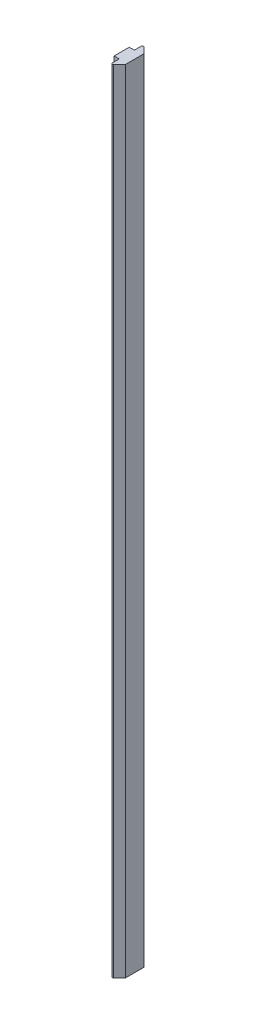
ISO-10303-21;
HEADER;
FILE_DESCRIPTION(('STEP AP214'),'2;1');
FILE_NAME('part.step','',(''),(''),'','','');
FILE_SCHEMA(('AUTOMOTIVE_DESIGN { 1 0 10303 214 1 1 1 1 }'));
ENDSEC;
DATA;
#1=APPLICATION_CONTEXT('core data for automotive mechanical design processes');
#2=APPLICATION_PROTOCOL_DEFINITION('international standard','automotive_design',2000,#1);
#3=PRODUCT_CONTEXT('',#1,'mechanical');
#4=PRODUCT('Part','Part','',(#3));
#5=PRODUCT_RELATED_PRODUCT_CATEGORY('part','',(#4));
#6=PRODUCT_DEFINITION_FORMATION('','',#4);
#7=PRODUCT_DEFINITION_CONTEXT('part definition',#1,'design');
#8=PRODUCT_DEFINITION('design','',#6,#7);
#9=PRODUCT_DEFINITION_SHAPE('','',#8);
#10=(LENGTH_UNIT() NAMED_UNIT(*) SI_UNIT(.MILLI.,.METRE.));
#11=(NAMED_UNIT(*) PLANE_ANGLE_UNIT() SI_UNIT($,.RADIAN.));
#12=(NAMED_UNIT(*) SI_UNIT($,.STERADIAN.) SOLID_ANGLE_UNIT());
#13=UNCERTAINTY_MEASURE_WITH_UNIT(LENGTH_MEASURE(1.E-05),#10,'distance_accuracy_value','');
#14=(GEOMETRIC_REPRESENTATION_CONTEXT(3) GLOBAL_UNCERTAINTY_ASSIGNED_CONTEXT((#13)) GLOBAL_UNIT_ASSIGNED_CONTEXT((#10,
#11,#12)) REPRESENTATION_CONTEXT('',''));
#15=CARTESIAN_POINT('',(0.,0.,0.));
#16=DIRECTION('',(0.,0.,1.));
#17=DIRECTION('',(1.,0.,0.));
#18=AXIS2_PLACEMENT_3D('',#15,#16,#17);
#19=CARTESIAN_POINT('',(-3.23933986621706,300.,2.87805090450655));
#20=DIRECTION('',(0.,0.,-1.));
#21=DIRECTION('',(-1.,0.,0.));
#22=AXIS2_PLACEMENT_3D('',#19,#20,#21);
#23=PLANE('',#22);
#24=DIRECTION('',(1.,0.,0.));
#25=VECTOR('',#24,1.);
#26=CARTESIAN_POINT('',(-3.23933986621706,0.,2.87805090450655));
#27=LINE('',#26,#25);
#28=CARTESIAN_POINT('',(-5.18933983831155,0.,2.87805090450655));
#29=VERTEX_POINT('',#28);
#30=CARTESIAN_POINT('',(-3.23933986621706,0.,2.87805090450655));
#31=VERTEX_POINT('',#30);
#32=EDGE_CURVE('E150',#29,#31,#27,.T.);
#33=ORIENTED_EDGE('',*,*,#32,.T.);
#34=DIRECTION('',(0.,-1.,0.));
#35=VECTOR('',#34,1.);
#36=CARTESIAN_POINT('',(-3.23933986621706,300.,2.87805090450655));
#37=LINE('',#36,#35);
#38=CARTESIAN_POINT('',(-3.23933986621706,300.,2.87805090450655));
#39=VERTEX_POINT('',#38);
#40=EDGE_CURVE('E11',#39,#31,#37,.T.);
#41=ORIENTED_EDGE('',*,*,#40,.F.);
#42=DIRECTION('',(1.,0.,0.));
#43=VECTOR('',#42,1.);
#44=CARTESIAN_POINT('',(-3.23933986621706,300.,2.87805090450655));
#45=LINE('',#44,#43);
#46=CARTESIAN_POINT('',(-5.18933983831155,300.,2.87805090450655));
#47=VERTEX_POINT('',#46);
#48=EDGE_CURVE('E165',#47,#39,#45,.T.);
#49=ORIENTED_EDGE('',*,*,#48,.F.);
#50=DIRECTION('',(0.,-1.,0.));
#51=VECTOR('',#50,1.);
#52=CARTESIAN_POINT('',(-5.18933983831155,300.,2.87805090450655));
#53=LINE('',#52,#51);
#54=EDGE_CURVE('E142',#47,#29,#53,.T.);
#55=ORIENTED_EDGE('',*,*,#54,.T.);
#56=EDGE_LOOP('',(#33,#41,#49,#55));
#57=FACE_BOUND('',#56,.T.);
#58=ADVANCED_FACE('F39',(#57),#23,.F.);
#59=CARTESIAN_POINT('',(-3.23933986621706,300.,2.87805090450655));
#60=DIRECTION('',(1.,0.,0.));
#61=DIRECTION('',(0.,0.,-1.));
#62=AXIS2_PLACEMENT_3D('',#59,#60,#61);
#63=PLANE('',#62);
#64=DIRECTION('',(0.,0.,1.));
#65=VECTOR('',#64,1.);
#66=CARTESIAN_POINT('',(-3.23933986621706,0.,2.87805090450655));
#67=LINE('',#66,#65);
#68=CARTESIAN_POINT('',(-3.23933986621706,0.,5.42744122113594));
#69=VERTEX_POINT('',#68);
#70=EDGE_CURVE('E148',#31,#69,#67,.T.);
#71=ORIENTED_EDGE('',*,*,#70,.T.);
#72=DIRECTION('',(0.,-1.,0.));
#73=VECTOR('',#72,1.);
#74=CARTESIAN_POINT('',(-3.23933986621706,300.,5.42744122113594));
#75=LINE('',#74,#73);
#76=CARTESIAN_POINT('',(-3.23933986621706,300.,5.42744122113594));
#77=VERTEX_POINT('',#76);
#78=EDGE_CURVE('E50',#77,#69,#75,.T.);
#79=ORIENTED_EDGE('',*,*,#78,.F.);
#80=DIRECTION('',(0.,0.,1.));
#81=VECTOR('',#80,1.);
#82=CARTESIAN_POINT('',(-3.23933986621706,300.,2.87805090450655));
#83=LINE('',#82,#81);
#84=EDGE_CURVE('E104',#39,#77,#83,.T.);
#85=ORIENTED_EDGE('',*,*,#84,.F.);
#86=ORIENTED_EDGE('',*,*,#40,.T.);
#87=EDGE_LOOP('',(#71,#79,#85,#86));
#88=FACE_BOUND('',#87,.T.);
#89=ADVANCED_FACE('F215',(#88),#63,.F.);
#90=CARTESIAN_POINT('',(-2.78933986621717,300.,5.42744122113487));
#91=DIRECTION('',(0.,-1.,0.));
#92=DIRECTION('',(0.,0.,-1.));
#93=AXIS2_PLACEMENT_3D('',#90,#91,#92);
#94=CYLINDRICAL_SURFACE('',#93,0.449999999999945);
#95=CARTESIAN_POINT('',(-2.78933986621717,0.,5.42744122113487));
#96=DIRECTION('',(0.,1.,0.));
#97=DIRECTION('',(0.,0.,1.));
#98=AXIS2_PLACEMENT_3D('',#95,#96,#97);
#99=CIRCLE('',#98,0.449999999999945);
#100=CARTESIAN_POINT('',(-2.47114181468326,0.,5.74563927266877));
#101=VERTEX_POINT('',#100);
#102=EDGE_CURVE('E152',#69,#101,#99,.T.);
#103=ORIENTED_EDGE('',*,*,#102,.T.);
#104=DIRECTION('',(0.,-1.,0.));
#105=VECTOR('',#104,1.);
#106=CARTESIAN_POINT('',(-2.47114181468326,300.,5.74563927266877));
#107=LINE('',#106,#105);
#108=CARTESIAN_POINT('',(-2.47114181468326,300.,5.74563927266877));
#109=VERTEX_POINT('',#108);
#110=EDGE_CURVE('E178',#109,#101,#107,.T.);
#111=ORIENTED_EDGE('',*,*,#110,.F.);
#112=CARTESIAN_POINT('',(-2.78933986621717,300.,5.42744122113487));
#113=DIRECTION('',(0.,1.,0.));
#114=DIRECTION('',(0.,0.,1.));
#115=AXIS2_PLACEMENT_3D('',#112,#113,#114);
#116=CIRCLE('',#115,0.449999999999945);
#117=EDGE_CURVE('E186',#77,#109,#116,.T.);
#118=ORIENTED_EDGE('',*,*,#117,.F.);
#119=ORIENTED_EDGE('',*,*,#78,.T.);
#120=EDGE_LOOP('',(#103,#111,#118,#119));
#121=FACE_BOUND('',#120,.T.);
#122=ADVANCED_FACE('F182',(#121),#94,.T.);
#123=CARTESIAN_POINT('',(-2.47114181468322,300.,5.74563927266882));
#124=DIRECTION('',(-0.707106781186551,0.,-0.707106781186544));
#125=DIRECTION('',(-0.707106781186544,0.,0.707106781186551));
#126=AXIS2_PLACEMENT_3D('',#123,#124,#125);
#127=PLANE('',#126);
#128=DIRECTION('',(0.707106781186544,0.,-0.707106781186551));
#129=VECTOR('',#128,1.);
#130=CARTESIAN_POINT('',(-2.47114181468322,0.,5.74563927266882));
#131=LINE('',#130,#129);
#132=CARTESIAN_POINT('',(-0.249999999999999,0.,3.52449745798557));
#133=VERTEX_POINT('',#132);
#134=EDGE_CURVE('E153',#101,#133,#131,.T.);
#135=ORIENTED_EDGE('',*,*,#134,.T.);
#136=DIRECTION('',(0.,-1.,0.));
#137=VECTOR('',#136,1.);
#138=CARTESIAN_POINT('',(-0.249999999999999,300.,3.52449745798557));
#139=LINE('',#138,#137);
#140=CARTESIAN_POINT('',(-0.249999999999999,300.,3.52449745798557));
#141=VERTEX_POINT('',#140);
#142=EDGE_CURVE('E172',#141,#133,#139,.T.);
#143=ORIENTED_EDGE('',*,*,#142,.F.);
#144=DIRECTION('',(0.707106781186544,0.,-0.707106781186551));
#145=VECTOR('',#144,1.);
#146=CARTESIAN_POINT('',(-2.47114181468322,300.,5.74563927266882));
#147=LINE('',#146,#145);
#148=EDGE_CURVE('E204',#109,#141,#147,.T.);
#149=ORIENTED_EDGE('',*,*,#148,.F.);
#150=ORIENTED_EDGE('',*,*,#110,.T.);
#151=EDGE_LOOP('',(#135,#143,#149,#150));
#152=FACE_BOUND('',#151,.T.);
#153=ADVANCED_FACE('F193',(#152),#127,.F.);
#154=CARTESIAN_POINT('',(-0.25,300.,-3.52449745798557));
#155=DIRECTION('',(-1.,0.,0.));
#156=DIRECTION('',(0.,0.,1.));
#157=AXIS2_PLACEMENT_3D('',#154,#155,#156);
#158=PLANE('',#157);
#159=DIRECTION('',(0.,0.,-1.));
#160=VECTOR('',#159,1.);
#161=CARTESIAN_POINT('',(-0.25,0.,-3.52449745798557));
#162=LINE('',#161,#160);
#163=CARTESIAN_POINT('',(-0.25,0.,-3.52449745798557));
#164=VERTEX_POINT('',#163);
#165=EDGE_CURVE('E157',#133,#164,#162,.T.);
#166=ORIENTED_EDGE('',*,*,#165,.T.);
#167=DIRECTION('',(0.,-1.,0.));
#168=VECTOR('',#167,1.);
#169=CARTESIAN_POINT('',(-0.25,300.,-3.52449745798557));
#170=LINE('',#169,#168);
#171=CARTESIAN_POINT('',(-0.25,300.,-3.52449745798557));
#172=VERTEX_POINT('',#171);
#173=EDGE_CURVE('E175',#172,#164,#170,.T.);
#174=ORIENTED_EDGE('',*,*,#173,.F.);
#175=DIRECTION('',(0.,0.,-1.));
#176=VECTOR('',#175,1.);
#177=CARTESIAN_POINT('',(-0.25,300.,-3.52449745798557));
#178=LINE('',#177,#176);
#179=EDGE_CURVE('E202',#141,#172,#178,.T.);
#180=ORIENTED_EDGE('',*,*,#179,.F.);
#181=ORIENTED_EDGE('',*,*,#142,.T.);
#182=EDGE_LOOP('',(#166,#174,#180,#181));
#183=FACE_BOUND('',#182,.T.);
#184=ADVANCED_FACE('F198',(#183),#158,.F.);
#185=CARTESIAN_POINT('',(-0.25,300.,-3.52449745798557));
#186=DIRECTION('',(-0.707106781186547,0.,0.707106781186548));
#187=DIRECTION('',(0.707106781186548,0.,0.707106781186547));
#188=AXIS2_PLACEMENT_3D('',#185,#186,#187);
#189=PLANE('',#188);
#190=DIRECTION('',(-0.707106781186548,0.,-0.707106781186547));
#191=VECTOR('',#190,1.);
#192=CARTESIAN_POINT('',(-0.25,0.,-3.52449745798557));
#193=LINE('',#192,#191);
#194=CARTESIAN_POINT('',(-2.47114181360244,0.,-5.74563927158801));
#195=VERTEX_POINT('',#194);
#196=EDGE_CURVE('E156',#164,#195,#193,.T.);
#197=ORIENTED_EDGE('',*,*,#196,.T.);
#198=DIRECTION('',(0.,-1.,0.));
#199=VECTOR('',#198,1.);
#200=CARTESIAN_POINT('',(-2.47114181360244,300.,-5.74563927158801));
#201=LINE('',#200,#199);
#202=CARTESIAN_POINT('',(-2.47114181360244,300.,-5.74563927158801));
#203=VERTEX_POINT('',#202);
#204=EDGE_CURVE('E170',#203,#195,#201,.T.);
#205=ORIENTED_EDGE('',*,*,#204,.F.);
#206=DIRECTION('',(-0.707106781186548,0.,-0.707106781186547));
#207=VECTOR('',#206,1.);
#208=CARTESIAN_POINT('',(-0.25,300.,-3.52449745798557));
#209=LINE('',#208,#207);
#210=EDGE_CURVE('E201',#172,#203,#209,.T.);
#211=ORIENTED_EDGE('',*,*,#210,.F.);
#212=ORIENTED_EDGE('',*,*,#173,.T.);
#213=EDGE_LOOP('',(#197,#205,#211,#212));
#214=FACE_BOUND('',#213,.T.);
#215=ADVANCED_FACE('F226',(#214),#189,.F.);
#216=CARTESIAN_POINT('',(-2.78933986469227,300.,-5.42744122049819));
#217=DIRECTION('',(0.,-1.,0.));
#218=DIRECTION('',(0.,0.,-1.));
#219=AXIS2_PLACEMENT_3D('',#216,#217,#218);
#220=CYLINDRICAL_SURFACE('',#219,0.449999999371916);
#221=CARTESIAN_POINT('',(-2.78933986469227,0.,-5.42744122049819));
#222=DIRECTION('',(0.,1.,0.));
#223=DIRECTION('',(0.,0.,1.));
#224=AXIS2_PLACEMENT_3D('',#221,#222,#223);
#225=CIRCLE('',#224,0.449999999371916);
#226=CARTESIAN_POINT('',(-3.23933986406418,0.,-5.42744122190511));
#227=VERTEX_POINT('',#226);
#228=EDGE_CURVE('E158',#195,#227,#225,.T.);
#229=ORIENTED_EDGE('',*,*,#228,.T.);
#230=DIRECTION('',(0.,-1.,0.));
#231=VECTOR('',#230,1.);
#232=CARTESIAN_POINT('',(-3.23933986406418,300.,-5.42744122190511));
#233=LINE('',#232,#231);
#234=CARTESIAN_POINT('',(-3.23933986406418,300.,-5.42744122190511));
#235=VERTEX_POINT('',#234);
#236=EDGE_CURVE('E138',#235,#227,#233,.T.);
#237=ORIENTED_EDGE('',*,*,#236,.F.);
#238=CARTESIAN_POINT('',(-2.78933986469227,300.,-5.42744122049819));
#239=DIRECTION('',(0.,1.,0.));
#240=DIRECTION('',(0.,0.,1.));
#241=AXIS2_PLACEMENT_3D('',#238,#239,#240);
#242=CIRCLE('',#241,0.449999999371916);
#243=EDGE_CURVE('E126',#203,#235,#242,.T.);
#244=ORIENTED_EDGE('',*,*,#243,.F.);
#245=ORIENTED_EDGE('',*,*,#204,.T.);
#246=EDGE_LOOP('',(#229,#237,#244,#245));
#247=FACE_BOUND('',#246,.T.);
#248=ADVANCED_FACE('F227',(#247),#220,.T.);
#249=CARTESIAN_POINT('',(-3.23933986406418,300.,-5.42744122190511));
#250=DIRECTION('',(1.,0.,0.));
#251=DIRECTION('',(0.,0.,-1.));
#252=AXIS2_PLACEMENT_3D('',#249,#250,#251);
#253=PLANE('',#252);
#254=DIRECTION('',(0.,0.,1.));
#255=VECTOR('',#254,1.);
#256=CARTESIAN_POINT('',(-3.23933986406418,0.,-5.42744122190511));
#257=LINE('',#256,#255);
#258=CARTESIAN_POINT('',(-3.23933986406424,0.,-2.87805084858101));
#259=VERTEX_POINT('',#258);
#260=EDGE_CURVE('E140',#227,#259,#257,.T.);
#261=ORIENTED_EDGE('',*,*,#260,.T.);
#262=DIRECTION('',(0.,-1.,0.));
#263=VECTOR('',#262,1.);
#264=CARTESIAN_POINT('',(-3.23933986406424,300.,-2.87805084858101));
#265=LINE('',#264,#263);
#266=CARTESIAN_POINT('',(-3.23933986406424,300.,-2.87805084858101));
#267=VERTEX_POINT('',#266);
#268=EDGE_CURVE('E132',#267,#259,#265,.T.);
#269=ORIENTED_EDGE('',*,*,#268,.F.);
#270=DIRECTION('',(0.,0.,1.));
#271=VECTOR('',#270,1.);
#272=CARTESIAN_POINT('',(-3.23933986406418,300.,-5.42744122190511));
#273=LINE('',#272,#271);
#274=EDGE_CURVE('E122',#235,#267,#273,.T.);
#275=ORIENTED_EDGE('',*,*,#274,.F.);
#276=ORIENTED_EDGE('',*,*,#236,.T.);
#277=EDGE_LOOP('',(#261,#269,#275,#276));
#278=FACE_BOUND('',#277,.T.);
#279=ADVANCED_FACE('F134',(#278),#253,.F.);
#280=CARTESIAN_POINT('',(-4.93933983831159,300.,-2.87805084858101));
#281=DIRECTION('',(0.,0.,1.));
#282=DIRECTION('',(1.,0.,0.));
#283=AXIS2_PLACEMENT_3D('',#280,#281,#282);
#284=PLANE('',#283);
#285=DIRECTION('',(-1.,0.,0.));
#286=VECTOR('',#285,1.);
#287=CARTESIAN_POINT('',(-4.93933983831159,0.,-2.87805084858101));
#288=LINE('',#287,#286);
#289=CARTESIAN_POINT('',(-5.18933983831155,0.,-2.87805084858101));
#290=VERTEX_POINT('',#289);
#291=EDGE_CURVE('E87',#259,#290,#288,.T.);
#292=ORIENTED_EDGE('',*,*,#291,.T.);
#293=DIRECTION('',(0.,-1.,0.));
#294=VECTOR('',#293,1.);
#295=CARTESIAN_POINT('',(-5.18933983831155,300.,-2.87805084858101));
#296=LINE('',#295,#294);
#297=CARTESIAN_POINT('',(-5.18933983831155,300.,-2.87805084858101));
#298=VERTEX_POINT('',#297);
#299=EDGE_CURVE('E137',#298,#290,#296,.T.);
#300=ORIENTED_EDGE('',*,*,#299,.F.);
#301=DIRECTION('',(-1.,0.,0.));
#302=VECTOR('',#301,1.);
#303=CARTESIAN_POINT('',(-3.23933986406424,300.,-2.87805084858101));
#304=LINE('',#303,#302);
#305=EDGE_CURVE('E128',#267,#298,#304,.T.);
#306=ORIENTED_EDGE('',*,*,#305,.F.);
#307=ORIENTED_EDGE('',*,*,#268,.T.);
#308=EDGE_LOOP('',(#292,#300,#306,#307));
#309=FACE_BOUND('',#308,.T.);
#310=ADVANCED_FACE('F141',(#309),#284,.F.);
#311=CARTESIAN_POINT('',(-5.18933983831155,300.,-2.87805084858101));
#312=DIRECTION('',(1.,0.,0.));
#313=DIRECTION('',(0.,0.,-1.));
#314=AXIS2_PLACEMENT_3D('',#311,#312,#313);
#315=PLANE('',#314);
#316=DIRECTION('',(0.,0.,1.));
#317=VECTOR('',#316,1.);
#318=CARTESIAN_POINT('',(-5.18933983831155,0.,-2.87805084858101));
#319=LINE('',#318,#317);
#320=EDGE_CURVE('E94',#290,#29,#319,.T.);
#321=ORIENTED_EDGE('',*,*,#320,.T.);
#322=ORIENTED_EDGE('',*,*,#54,.F.);
#323=DIRECTION('',(0.,0.,1.));
#324=VECTOR('',#323,1.);
#325=CARTESIAN_POINT('',(-5.18933983831155,300.,-2.87805084858101));
#326=LINE('',#325,#324);
#327=EDGE_CURVE('E54',#298,#47,#326,.T.);
#328=ORIENTED_EDGE('',*,*,#327,.F.);
#329=ORIENTED_EDGE('',*,*,#299,.T.);
#330=EDGE_LOOP('',(#321,#322,#328,#329));
#331=FACE_BOUND('',#330,.T.);
#332=ADVANCED_FACE('F239',(#331),#315,.F.);
#333=CARTESIAN_POINT('',(-2.78933986469227,300.,-5.42744122049819));
#334=DIRECTION('',(0.,1.,0.));
#335=DIRECTION('',(0.,0.,1.));
#336=AXIS2_PLACEMENT_3D('',#333,#334,#335);
#337=PLANE('',#336);
#338=ORIENTED_EDGE('',*,*,#48,.T.);
#339=ORIENTED_EDGE('',*,*,#84,.T.);
#340=ORIENTED_EDGE('',*,*,#117,.T.);
#341=ORIENTED_EDGE('',*,*,#148,.T.);
#342=ORIENTED_EDGE('',*,*,#179,.T.);
#343=ORIENTED_EDGE('',*,*,#210,.T.);
#344=ORIENTED_EDGE('',*,*,#243,.T.);
#345=ORIENTED_EDGE('',*,*,#274,.T.);
#346=ORIENTED_EDGE('',*,*,#305,.T.);
#347=ORIENTED_EDGE('',*,*,#327,.T.);
#348=EDGE_LOOP('',(#338,#339,#340,#341,#342,#343,#344,#345,#346,#347));
#349=FACE_BOUND('',#348,.T.);
#350=ADVANCED_FACE('F125',(#349),#337,.T.);
#351=CARTESIAN_POINT('',(-2.78933986469227,0.,-5.42744122049819));
#352=DIRECTION('',(0.,1.,0.));
#353=DIRECTION('',(0.,0.,1.));
#354=AXIS2_PLACEMENT_3D('',#351,#352,#353);
#355=PLANE('',#354);
#356=ORIENTED_EDGE('',*,*,#32,.F.);
#357=ORIENTED_EDGE('',*,*,#320,.F.);
#358=ORIENTED_EDGE('',*,*,#291,.F.);
#359=ORIENTED_EDGE('',*,*,#260,.F.);
#360=ORIENTED_EDGE('',*,*,#228,.F.);
#361=ORIENTED_EDGE('',*,*,#196,.F.);
#362=ORIENTED_EDGE('',*,*,#165,.F.);
#363=ORIENTED_EDGE('',*,*,#134,.F.);
#364=ORIENTED_EDGE('',*,*,#102,.F.);
#365=ORIENTED_EDGE('',*,*,#70,.F.);
#366=EDGE_LOOP('',(#356,#357,#358,#359,#360,#361,#362,#363,#364,#365));
#367=FACE_BOUND('',#366,.T.);
#368=ADVANCED_FACE('F189',(#367),#355,.F.);
#369=CLOSED_SHELL('',(#58,#89,#122,#153,#184,#215,#248,#279,#310,#332,#350,#368));
#370=MANIFOLD_SOLID_BREP('B2',#369);
#371=ADVANCED_BREP_SHAPE_REPRESENTATION('',(#18,#370),#14);
#372=SHAPE_DEFINITION_REPRESENTATION(#9,#371);
ENDSEC;
END-ISO-10303-21;
